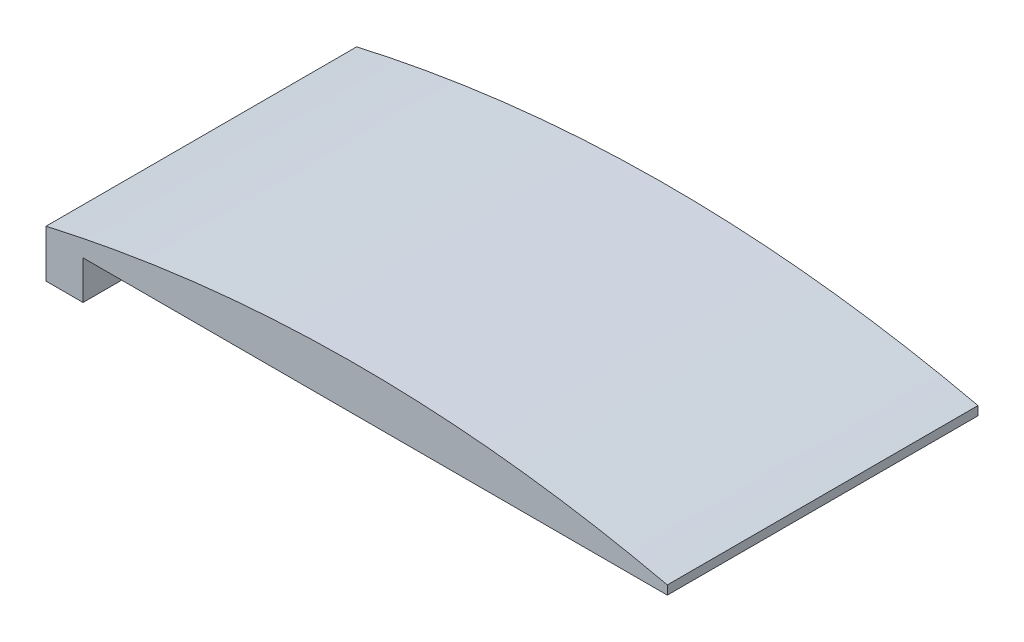
ISO-10303-21;
HEADER;
FILE_DESCRIPTION(('STEP AP214'),'2;1');
FILE_NAME('part.step','',(''),(''),'','','');
FILE_SCHEMA(('AUTOMOTIVE_DESIGN { 1 0 10303 214 1 1 1 1 }'));
ENDSEC;
DATA;
#1=APPLICATION_CONTEXT('core data for automotive mechanical design processes');
#2=APPLICATION_PROTOCOL_DEFINITION('international standard','automotive_design',2000,#1);
#3=PRODUCT_CONTEXT('',#1,'mechanical');
#4=PRODUCT('Part','Part','',(#3));
#5=PRODUCT_RELATED_PRODUCT_CATEGORY('part','',(#4));
#6=PRODUCT_DEFINITION_FORMATION('','',#4);
#7=PRODUCT_DEFINITION_CONTEXT('part definition',#1,'design');
#8=PRODUCT_DEFINITION('design','',#6,#7);
#9=PRODUCT_DEFINITION_SHAPE('','',#8);
#10=(LENGTH_UNIT() NAMED_UNIT(*) SI_UNIT(.MILLI.,.METRE.));
#11=(NAMED_UNIT(*) PLANE_ANGLE_UNIT() SI_UNIT($,.RADIAN.));
#12=(NAMED_UNIT(*) SI_UNIT($,.STERADIAN.) SOLID_ANGLE_UNIT());
#13=UNCERTAINTY_MEASURE_WITH_UNIT(LENGTH_MEASURE(1.E-05),#10,'distance_accuracy_value','');
#14=(GEOMETRIC_REPRESENTATION_CONTEXT(3) GLOBAL_UNCERTAINTY_ASSIGNED_CONTEXT((#13)) GLOBAL_UNIT_ASSIGNED_CONTEXT((#10,
#11,#12)) REPRESENTATION_CONTEXT('',''));
#15=CARTESIAN_POINT('',(0.,0.,0.));
#16=DIRECTION('',(0.,0.,1.));
#17=DIRECTION('',(1.,0.,0.));
#18=AXIS2_PLACEMENT_3D('',#15,#16,#17);
#19=CARTESIAN_POINT('',(0.,0.,-5.));
#20=DIRECTION('',(0.,0.,1.));
#21=DIRECTION('',(1.,0.,0.));
#22=AXIS2_PLACEMENT_3D('',#19,#20,#21);
#23=PLANE('',#22);
#24=DIRECTION('',(1.,0.,0.));
#25=VECTOR('',#24,1.);
#26=CARTESIAN_POINT('',(8.35,-2.86684932456372,-5.));
#27=LINE('',#26,#25);
#28=CARTESIAN_POINT('',(0.,-2.86684932456372,-5.));
#29=VERTEX_POINT('',#28);
#30=CARTESIAN_POINT('',(8.35,-2.86684932456372,-5.));
#31=VERTEX_POINT('',#30);
#32=EDGE_CURVE('E63',#29,#31,#27,.T.);
#33=ORIENTED_EDGE('',*,*,#32,.F.);
#34=DIRECTION('',(0.,-1.,0.));
#35=VECTOR('',#34,1.);
#36=CARTESIAN_POINT('',(0.,1.28315067543627,-5.));
#37=LINE('',#36,#35);
#38=CARTESIAN_POINT('',(0.,0.,-5.));
#39=VERTEX_POINT('',#38);
#40=EDGE_CURVE('E161',#39,#29,#37,.T.);
#41=ORIENTED_EDGE('',*,*,#40,.F.);
#42=DIRECTION('',(-1.,0.,0.));
#43=VECTOR('',#42,1.);
#44=CARTESIAN_POINT('',(0.,0.,-5.));
#45=LINE('',#44,#43);
#46=CARTESIAN_POINT('',(8.35,0.,-5.));
#47=VERTEX_POINT('',#46);
#48=EDGE_CURVE('E11',#47,#39,#45,.T.);
#49=ORIENTED_EDGE('',*,*,#48,.F.);
#50=DIRECTION('',(0.,1.,0.));
#51=VECTOR('',#50,1.);
#52=CARTESIAN_POINT('',(8.35,1.28315067543627,-5.));
#53=LINE('',#52,#51);
#54=EDGE_CURVE('E164',#31,#47,#53,.T.);
#55=ORIENTED_EDGE('',*,*,#54,.F.);
#56=EDGE_LOOP('',(#33,#41,#49,#55));
#57=FACE_BOUND('',#56,.T.);
#58=ADVANCED_FACE('F47',(#57),#23,.F.);
#59=CARTESIAN_POINT('',(0.,2.,-70.));
#60=DIRECTION('',(-1.,0.,0.));
#61=DIRECTION('',(0.,0.,1.));
#62=AXIS2_PLACEMENT_3D('',#59,#60,#61);
#63=PLANE('',#62);
#64=DIRECTION('',(0.,0.,1.));
#65=VECTOR('',#64,1.);
#66=CARTESIAN_POINT('',(0.,-8.71684932456373,-5.));
#67=LINE('',#66,#65);
#68=CARTESIAN_POINT('',(0.,-8.71684932456373,-70.));
#69=VERTEX_POINT('',#68);
#70=CARTESIAN_POINT('',(0.,-8.71684932456373,0.));
#71=VERTEX_POINT('',#70);
#72=EDGE_CURVE('E129',#69,#71,#67,.T.);
#73=ORIENTED_EDGE('',*,*,#72,.T.);
#74=DIRECTION('',(0.,-1.,0.));
#75=VECTOR('',#74,1.);
#76=CARTESIAN_POINT('',(0.,2.,0.));
#77=LINE('',#76,#75);
#78=CARTESIAN_POINT('',(0.,2.,0.));
#79=VERTEX_POINT('',#78);
#80=EDGE_CURVE('E175',#79,#71,#77,.T.);
#81=ORIENTED_EDGE('',*,*,#80,.F.);
#82=DIRECTION('',(0.,0.,1.));
#83=VECTOR('',#82,1.);
#84=CARTESIAN_POINT('',(0.,2.,-70.));
#85=LINE('',#84,#83);
#86=CARTESIAN_POINT('',(0.,2.,-70.));
#87=VERTEX_POINT('',#86);
#88=EDGE_CURVE('E56',#87,#79,#85,.T.);
#89=ORIENTED_EDGE('',*,*,#88,.F.);
#90=DIRECTION('',(0.,-1.,0.));
#91=VECTOR('',#90,1.);
#92=CARTESIAN_POINT('',(0.,2.,-70.));
#93=LINE('',#92,#91);
#94=CARTESIAN_POINT('',(0.,0.,-70.));
#95=VERTEX_POINT('',#94);
#96=EDGE_CURVE('E176',#87,#95,#93,.T.);
#97=ORIENTED_EDGE('',*,*,#96,.T.);
#98=DIRECTION('',(0.,0.,1.));
#99=VECTOR('',#98,1.);
#100=CARTESIAN_POINT('',(0.,0.,-70.));
#101=LINE('',#100,#99);
#102=EDGE_CURVE('E195',#95,#39,#101,.T.);
#103=ORIENTED_EDGE('',*,*,#102,.T.);
#104=ORIENTED_EDGE('',*,*,#40,.T.);
#105=DIRECTION('',(0.,0.,1.));
#106=VECTOR('',#105,1.);
#107=CARTESIAN_POINT('',(0.,-2.86684932456372,-70.));
#108=LINE('',#107,#106);
#109=CARTESIAN_POINT('',(0.,-2.86684932456372,-70.));
#110=VERTEX_POINT('',#109);
#111=EDGE_CURVE('E156',#110,#29,#108,.T.);
#112=ORIENTED_EDGE('',*,*,#111,.F.);
#113=DIRECTION('',(0.,1.,0.));
#114=VECTOR('',#113,1.);
#115=CARTESIAN_POINT('',(0.,-8.71684932456373,-70.));
#116=LINE('',#115,#114);
#117=EDGE_CURVE('E138',#69,#110,#116,.T.);
#118=ORIENTED_EDGE('',*,*,#117,.F.);
#119=EDGE_LOOP('',(#73,#81,#89,#97,#103,#104,#112,#118));
#120=FACE_BOUND('',#119,.T.);
#121=ADVANCED_FACE('F49',(#120),#63,.T.);
#122=CARTESIAN_POINT('',(140.,2.,-70.));
#123=CARTESIAN_POINT('',(70.,18.,-70.));
#124=CARTESIAN_POINT('',(0.,2.,-70.));
#125=B_SPLINE_CURVE_WITH_KNOTS('',2,(#122,#123,#124),.UNSPECIFIED.,.F.,.F.,(3,3),(0.,1.),.UNSPECIFIED.);
#126=DIRECTION('',(0.,0.,1.));
#127=VECTOR('',#126,1.);
#128=SURFACE_OF_LINEAR_EXTRUSION('',#125,#127);
#129=CARTESIAN_POINT('',(140.,2.,-70.));
#130=VERTEX_POINT('',#129);
#131=EDGE_CURVE('E189',#130,#87,#125,.T.);
#132=ORIENTED_EDGE('',*,*,#131,.T.);
#133=ORIENTED_EDGE('',*,*,#88,.T.);
#134=CARTESIAN_POINT('',(140.,2.,0.));
#135=CARTESIAN_POINT('',(70.,18.,0.));
#136=CARTESIAN_POINT('',(0.,2.,0.));
#137=B_SPLINE_CURVE_WITH_KNOTS('',2,(#134,#135,#136),.UNSPECIFIED.,.F.,.F.,(3,3),(0.,1.),.UNSPECIFIED.);
#138=CARTESIAN_POINT('',(140.,2.,0.));
#139=VERTEX_POINT('',#138);
#140=EDGE_CURVE('E181',#139,#79,#137,.T.);
#141=ORIENTED_EDGE('',*,*,#140,.F.);
#142=DIRECTION('',(0.,0.,1.));
#143=VECTOR('',#142,1.);
#144=CARTESIAN_POINT('',(140.,2.,-70.));
#145=LINE('',#144,#143);
#146=EDGE_CURVE('E267',#130,#139,#145,.T.);
#147=ORIENTED_EDGE('',*,*,#146,.F.);
#148=EDGE_LOOP('',(#132,#133,#141,#147));
#149=FACE_BOUND('',#148,.T.);
#150=ADVANCED_FACE('F201',(#149),#128,.T.);
#151=CARTESIAN_POINT('',(140.,2.,-70.));
#152=DIRECTION('',(1.,0.,0.));
#153=DIRECTION('',(0.,0.,-1.));
#154=AXIS2_PLACEMENT_3D('',#151,#152,#153);
#155=PLANE('',#154);
#156=DIRECTION('',(0.,1.,0.));
#157=VECTOR('',#156,1.);
#158=CARTESIAN_POINT('',(140.,2.,0.));
#159=LINE('',#158,#157);
#160=CARTESIAN_POINT('',(140.,0.,0.));
#161=VERTEX_POINT('',#160);
#162=EDGE_CURVE('E252',#161,#139,#159,.T.);
#163=ORIENTED_EDGE('',*,*,#162,.F.);
#164=DIRECTION('',(0.,0.,1.));
#165=VECTOR('',#164,1.);
#166=CARTESIAN_POINT('',(140.,0.,-70.));
#167=LINE('',#166,#165);
#168=CARTESIAN_POINT('',(140.,0.,-70.));
#169=VERTEX_POINT('',#168);
#170=EDGE_CURVE('E248',#169,#161,#167,.T.);
#171=ORIENTED_EDGE('',*,*,#170,.F.);
#172=DIRECTION('',(0.,1.,0.));
#173=VECTOR('',#172,1.);
#174=CARTESIAN_POINT('',(140.,2.,-70.));
#175=LINE('',#174,#173);
#176=EDGE_CURVE('E185',#169,#130,#175,.T.);
#177=ORIENTED_EDGE('',*,*,#176,.T.);
#178=ORIENTED_EDGE('',*,*,#146,.T.);
#179=EDGE_LOOP('',(#163,#171,#177,#178));
#180=FACE_BOUND('',#179,.T.);
#181=ADVANCED_FACE('F205',(#180),#155,.T.);
#182=CARTESIAN_POINT('',(0.,0.,-70.));
#183=DIRECTION('',(0.,-1.,0.));
#184=DIRECTION('',(0.,0.,-1.));
#185=AXIS2_PLACEMENT_3D('',#182,#183,#184);
#186=PLANE('',#185);
#187=DIRECTION('',(0.,0.,1.));
#188=VECTOR('',#187,1.);
#189=CARTESIAN_POINT('',(8.35,0.,-70.));
#190=LINE('',#189,#188);
#191=CARTESIAN_POINT('',(8.35,0.,0.));
#192=VERTEX_POINT('',#191);
#193=EDGE_CURVE('E128',#47,#192,#190,.T.);
#194=ORIENTED_EDGE('',*,*,#193,.F.);
#195=ORIENTED_EDGE('',*,*,#48,.T.);
#196=ORIENTED_EDGE('',*,*,#102,.F.);
#197=DIRECTION('',(1.,0.,0.));
#198=VECTOR('',#197,1.);
#199=CARTESIAN_POINT('',(0.,0.,-70.));
#200=LINE('',#199,#198);
#201=EDGE_CURVE('E180',#95,#169,#200,.T.);
#202=ORIENTED_EDGE('',*,*,#201,.T.);
#203=ORIENTED_EDGE('',*,*,#170,.T.);
#204=DIRECTION('',(1.,0.,0.));
#205=VECTOR('',#204,1.);
#206=CARTESIAN_POINT('',(0.,0.,0.));
#207=LINE('',#206,#205);
#208=EDGE_CURVE('E247',#192,#161,#207,.T.);
#209=ORIENTED_EDGE('',*,*,#208,.F.);
#210=EDGE_LOOP('',(#194,#195,#196,#202,#203,#209));
#211=FACE_BOUND('',#210,.T.);
#212=ADVANCED_FACE('F210',(#211),#186,.T.);
#213=CARTESIAN_POINT('',(70.,10.,-70.));
#214=DIRECTION('',(0.,0.,1.));
#215=DIRECTION('',(1.,0.,0.));
#216=AXIS2_PLACEMENT_3D('',#213,#214,#215);
#217=PLANE('',#216);
#218=ORIENTED_EDGE('',*,*,#96,.F.);
#219=ORIENTED_EDGE('',*,*,#131,.F.);
#220=ORIENTED_EDGE('',*,*,#176,.F.);
#221=ORIENTED_EDGE('',*,*,#201,.F.);
#222=EDGE_LOOP('',(#218,#219,#220,#221));
#223=FACE_BOUND('',#222,.T.);
#224=ADVANCED_FACE('F213',(#223),#217,.F.);
#225=CARTESIAN_POINT('',(70.,10.,0.));
#226=DIRECTION('',(0.,0.,1.));
#227=DIRECTION('',(1.,0.,0.));
#228=AXIS2_PLACEMENT_3D('',#225,#226,#227);
#229=PLANE('',#228);
#230=ORIENTED_EDGE('',*,*,#80,.T.);
#231=DIRECTION('',(1.,0.,0.));
#232=VECTOR('',#231,1.);
#233=CARTESIAN_POINT('',(0.,-8.71684932456373,0.));
#234=LINE('',#233,#232);
#235=CARTESIAN_POINT('',(8.35,-8.71684932456372,0.));
#236=VERTEX_POINT('',#235);
#237=EDGE_CURVE('E160',#71,#236,#234,.T.);
#238=ORIENTED_EDGE('',*,*,#237,.T.);
#239=DIRECTION('',(0.,1.,0.));
#240=VECTOR('',#239,1.);
#241=CARTESIAN_POINT('',(8.35,1.28315067543627,0.));
#242=LINE('',#241,#240);
#243=EDGE_CURVE('E71',#236,#192,#242,.T.);
#244=ORIENTED_EDGE('',*,*,#243,.T.);
#245=ORIENTED_EDGE('',*,*,#208,.T.);
#246=ORIENTED_EDGE('',*,*,#162,.T.);
#247=ORIENTED_EDGE('',*,*,#140,.T.);
#248=EDGE_LOOP('',(#230,#238,#244,#245,#246,#247));
#249=FACE_BOUND('',#248,.T.);
#250=ADVANCED_FACE('F207',(#249),#229,.T.);
#251=CARTESIAN_POINT('',(8.35,1.28315067543627,-5.));
#252=DIRECTION('',(1.,0.,0.));
#253=DIRECTION('',(0.,1.,0.));
#254=AXIS2_PLACEMENT_3D('',#251,#252,#253);
#255=PLANE('',#254);
#256=DIRECTION('',(0.,0.,1.));
#257=VECTOR('',#256,1.);
#258=CARTESIAN_POINT('',(8.35,-8.71684932456372,-5.));
#259=LINE('',#258,#257);
#260=CARTESIAN_POINT('',(8.35,-8.71684932456372,-70.));
#261=VERTEX_POINT('',#260);
#262=EDGE_CURVE('E119',#261,#236,#259,.T.);
#263=ORIENTED_EDGE('',*,*,#262,.F.);
#264=DIRECTION('',(0.,-1.,0.));
#265=VECTOR('',#264,1.);
#266=CARTESIAN_POINT('',(8.35,-8.71684932456372,-70.));
#267=LINE('',#266,#265);
#268=CARTESIAN_POINT('',(8.35,-2.86684932456372,-70.));
#269=VERTEX_POINT('',#268);
#270=EDGE_CURVE('E124',#269,#261,#267,.T.);
#271=ORIENTED_EDGE('',*,*,#270,.F.);
#272=DIRECTION('',(0.,0.,1.));
#273=VECTOR('',#272,1.);
#274=CARTESIAN_POINT('',(8.35,-2.86684932456372,-70.));
#275=LINE('',#274,#273);
#276=EDGE_CURVE('E152',#269,#31,#275,.T.);
#277=ORIENTED_EDGE('',*,*,#276,.T.);
#278=ORIENTED_EDGE('',*,*,#54,.T.);
#279=ORIENTED_EDGE('',*,*,#193,.T.);
#280=ORIENTED_EDGE('',*,*,#243,.F.);
#281=EDGE_LOOP('',(#263,#271,#277,#278,#279,#280));
#282=FACE_BOUND('',#281,.T.);
#283=ADVANCED_FACE('F121',(#282),#255,.T.);
#284=CARTESIAN_POINT('',(0.,-8.71684932456373,-5.));
#285=DIRECTION('',(0.,-1.,0.));
#286=DIRECTION('',(1.,0.,0.));
#287=AXIS2_PLACEMENT_3D('',#284,#285,#286);
#288=PLANE('',#287);
#289=ORIENTED_EDGE('',*,*,#237,.F.);
#290=ORIENTED_EDGE('',*,*,#72,.F.);
#291=DIRECTION('',(-1.,0.,0.));
#292=VECTOR('',#291,1.);
#293=CARTESIAN_POINT('',(8.35,-8.71684932456372,-70.));
#294=LINE('',#293,#292);
#295=EDGE_CURVE('E132',#261,#69,#294,.T.);
#296=ORIENTED_EDGE('',*,*,#295,.F.);
#297=ORIENTED_EDGE('',*,*,#262,.T.);
#298=EDGE_LOOP('',(#289,#290,#296,#297));
#299=FACE_BOUND('',#298,.T.);
#300=ADVANCED_FACE('F133',(#299),#288,.T.);
#301=CARTESIAN_POINT('',(8.35,-2.86684932456372,-70.));
#302=DIRECTION('',(0.,-1.,0.));
#303=DIRECTION('',(0.,0.,-1.));
#304=AXIS2_PLACEMENT_3D('',#301,#302,#303);
#305=PLANE('',#304);
#306=ORIENTED_EDGE('',*,*,#32,.T.);
#307=ORIENTED_EDGE('',*,*,#276,.F.);
#308=DIRECTION('',(1.,0.,0.));
#309=VECTOR('',#308,1.);
#310=CARTESIAN_POINT('',(8.35,-2.86684932456372,-70.));
#311=LINE('',#310,#309);
#312=EDGE_CURVE('E142',#110,#269,#311,.T.);
#313=ORIENTED_EDGE('',*,*,#312,.F.);
#314=ORIENTED_EDGE('',*,*,#111,.T.);
#315=EDGE_LOOP('',(#306,#307,#313,#314));
#316=FACE_BOUND('',#315,.T.);
#317=ADVANCED_FACE('F230',(#316),#305,.F.);
#318=CARTESIAN_POINT('',(0.,0.,-70.));
#319=DIRECTION('',(0.,0.,1.));
#320=DIRECTION('',(1.,0.,0.));
#321=AXIS2_PLACEMENT_3D('',#318,#319,#320);
#322=PLANE('',#321);
#323=ORIENTED_EDGE('',*,*,#270,.T.);
#324=ORIENTED_EDGE('',*,*,#295,.T.);
#325=ORIENTED_EDGE('',*,*,#117,.T.);
#326=ORIENTED_EDGE('',*,*,#312,.T.);
#327=EDGE_LOOP('',(#323,#324,#325,#326));
#328=FACE_BOUND('',#327,.T.);
#329=ADVANCED_FACE('F140',(#328),#322,.F.);
#330=CLOSED_SHELL('',(#58,#121,#150,#181,#212,#224,#250,#283,#300,#317,#329));
#331=MANIFOLD_SOLID_BREP('B2',#330);
#332=ADVANCED_BREP_SHAPE_REPRESENTATION('',(#18,#331),#14);
#333=SHAPE_DEFINITION_REPRESENTATION(#9,#332);
ENDSEC;
END-ISO-10303-21;
